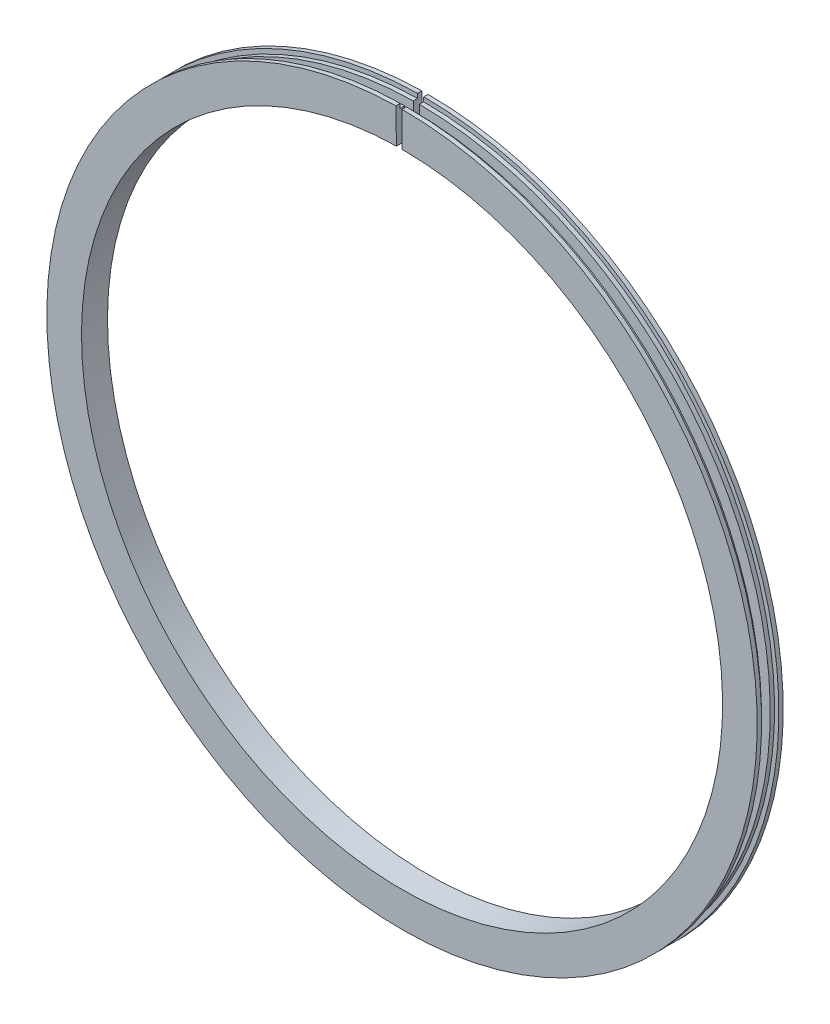
ISO-10303-21;
HEADER;
FILE_DESCRIPTION(('STEP AP214'),'2;1');
FILE_NAME('part.step','',(''),(''),'','','');
FILE_SCHEMA(('AUTOMOTIVE_DESIGN { 1 0 10303 214 1 1 1 1 }'));
ENDSEC;
DATA;
#1=APPLICATION_CONTEXT('core data for automotive mechanical design processes');
#2=APPLICATION_PROTOCOL_DEFINITION('international standard','automotive_design',2000,#1);
#3=PRODUCT_CONTEXT('',#1,'mechanical');
#4=PRODUCT('Part','Part','',(#3));
#5=PRODUCT_RELATED_PRODUCT_CATEGORY('part','',(#4));
#6=PRODUCT_DEFINITION_FORMATION('','',#4);
#7=PRODUCT_DEFINITION_CONTEXT('part definition',#1,'design');
#8=PRODUCT_DEFINITION('design','',#6,#7);
#9=PRODUCT_DEFINITION_SHAPE('','',#8);
#10=(LENGTH_UNIT() NAMED_UNIT(*) SI_UNIT(.MILLI.,.METRE.));
#11=(NAMED_UNIT(*) PLANE_ANGLE_UNIT() SI_UNIT($,.RADIAN.));
#12=(NAMED_UNIT(*) SI_UNIT($,.STERADIAN.) SOLID_ANGLE_UNIT());
#13=UNCERTAINTY_MEASURE_WITH_UNIT(LENGTH_MEASURE(1.E-05),#10,'distance_accuracy_value','');
#14=(GEOMETRIC_REPRESENTATION_CONTEXT(3) GLOBAL_UNCERTAINTY_ASSIGNED_CONTEXT((#13)) GLOBAL_UNIT_ASSIGNED_CONTEXT((#10,
#11,#12)) REPRESENTATION_CONTEXT('',''));
#15=CARTESIAN_POINT('',(0.,0.,0.));
#16=DIRECTION('',(0.,0.,1.));
#17=DIRECTION('',(1.,0.,0.));
#18=AXIS2_PLACEMENT_3D('',#15,#16,#17);
#19=CARTESIAN_POINT('',(0.,0.,0.));
#20=DIRECTION('',(0.,0.,1.));
#21=DIRECTION('',(1.,0.,0.));
#22=AXIS2_PLACEMENT_3D('',#19,#20,#21);
#23=CYLINDRICAL_SURFACE('',#22,37.);
#24=CARTESIAN_POINT('',(0.,0.,-3.));
#25=DIRECTION('',(0.,0.,1.));
#26=DIRECTION('',(1.,0.,0.));
#27=AXIS2_PLACEMENT_3D('',#24,#25,#26);
#28=CIRCLE('',#27,37.);
#29=CARTESIAN_POINT('',(-0.645739038178966,36.9943647207865,-3.));
#30=VERTEX_POINT('',#29);
#31=CARTESIAN_POINT('',(0.,37.,-3.));
#32=VERTEX_POINT('',#31);
#33=EDGE_CURVE('E11',#30,#32,#28,.T.);
#34=ORIENTED_EDGE('',*,*,#33,.F.);
#35=DIRECTION('',(0.,0.,1.));
#36=VECTOR('',#35,1.);
#37=CARTESIAN_POINT('',(-0.645739038178966,36.9943647207865,0.));
#38=LINE('',#37,#36);
#39=CARTESIAN_POINT('',(-0.645739038178966,36.9943647207865,0.));
#40=VERTEX_POINT('',#39);
#41=EDGE_CURVE('E135',#30,#40,#38,.T.);
#42=ORIENTED_EDGE('',*,*,#41,.T.);
#43=CARTESIAN_POINT('',(0.,0.,0.));
#44=DIRECTION('',(0.,0.,1.));
#45=DIRECTION('',(1.,0.,0.));
#46=AXIS2_PLACEMENT_3D('',#43,#44,#45);
#47=CIRCLE('',#46,37.);
#48=CARTESIAN_POINT('',(0.,37.,0.));
#49=VERTEX_POINT('',#48);
#50=EDGE_CURVE('E130',#40,#49,#47,.T.);
#51=ORIENTED_EDGE('',*,*,#50,.T.);
#52=DIRECTION('',(0.,0.,1.));
#53=VECTOR('',#52,1.);
#54=CARTESIAN_POINT('',(0.,37.,0.));
#55=LINE('',#54,#53);
#56=EDGE_CURVE('E133',#32,#49,#55,.T.);
#57=ORIENTED_EDGE('',*,*,#56,.F.);
#58=EDGE_LOOP('',(#34,#42,#51,#57));
#59=FACE_BOUND('',#58,.T.);
#60=ADVANCED_FACE('F45',(#59),#23,.F.);
#61=CARTESIAN_POINT('',(-0.645739038178966,36.9943647207865,-3.));
#62=DIRECTION('',(0.,0.,-1.));
#63=DIRECTION('',(-1.,0.,0.));
#64=AXIS2_PLACEMENT_3D('',#61,#62,#63);
#65=PLANE('',#64);
#66=CARTESIAN_POINT('',(0.,0.,-3.));
#67=DIRECTION('',(0.,0.,1.));
#68=DIRECTION('',(1.,0.,0.));
#69=AXIS2_PLACEMENT_3D('',#66,#67,#68);
#70=CIRCLE('',#69,41.);
#71=CARTESIAN_POINT('',(-0.715548663928043,40.993755501412,-3.));
#72=VERTEX_POINT('',#71);
#73=CARTESIAN_POINT('',(0.,41.,-3.));
#74=VERTEX_POINT('',#73);
#75=EDGE_CURVE('E54',#72,#74,#70,.T.);
#76=ORIENTED_EDGE('',*,*,#75,.F.);
#77=DIRECTION('',(0.0174524064372693,-0.999847695156391,0.));
#78=VECTOR('',#77,1.);
#79=CARTESIAN_POINT('',(-0.645739038178966,36.9943647207865,-3.));
#80=LINE('',#79,#78);
#81=EDGE_CURVE('E141',#72,#30,#80,.T.);
#82=ORIENTED_EDGE('',*,*,#81,.T.);
#83=ORIENTED_EDGE('',*,*,#33,.T.);
#84=DIRECTION('',(0.,-1.,0.));
#85=VECTOR('',#84,1.);
#86=CARTESIAN_POINT('',(0.,37.,-3.));
#87=LINE('',#86,#85);
#88=EDGE_CURVE('E155',#74,#32,#87,.T.);
#89=ORIENTED_EDGE('',*,*,#88,.F.);
#90=EDGE_LOOP('',(#76,#82,#83,#89));
#91=FACE_BOUND('',#90,.T.);
#92=ADVANCED_FACE('F47',(#91),#65,.T.);
#93=CARTESIAN_POINT('',(0.,0.,0.));
#94=DIRECTION('',(0.,0.,1.));
#95=DIRECTION('',(1.,0.,0.));
#96=AXIS2_PLACEMENT_3D('',#93,#94,#95);
#97=CYLINDRICAL_SURFACE('',#96,41.);
#98=CARTESIAN_POINT('',(0.,0.,-2.5));
#99=DIRECTION('',(0.,0.,1.));
#100=DIRECTION('',(1.,0.,0.));
#101=AXIS2_PLACEMENT_3D('',#98,#99,#100);
#102=CIRCLE('',#101,41.);
#103=CARTESIAN_POINT('',(-0.715548663928043,40.993755501412,-2.5));
#104=VERTEX_POINT('',#103);
#105=CARTESIAN_POINT('',(0.,41.,-2.5));
#106=VERTEX_POINT('',#105);
#107=EDGE_CURVE('E259',#104,#106,#102,.T.);
#108=ORIENTED_EDGE('',*,*,#107,.F.);
#109=DIRECTION('',(0.,0.,-1.));
#110=VECTOR('',#109,1.);
#111=CARTESIAN_POINT('',(-0.715548663928043,40.993755501412,-3.));
#112=LINE('',#111,#110);
#113=EDGE_CURVE('E231',#104,#72,#112,.T.);
#114=ORIENTED_EDGE('',*,*,#113,.T.);
#115=ORIENTED_EDGE('',*,*,#75,.T.);
#116=DIRECTION('',(0.,0.,-1.));
#117=VECTOR('',#116,1.);
#118=CARTESIAN_POINT('',(0.,41.,-3.));
#119=LINE('',#118,#117);
#120=EDGE_CURVE('E189',#106,#74,#119,.T.);
#121=ORIENTED_EDGE('',*,*,#120,.F.);
#122=EDGE_LOOP('',(#108,#114,#115,#121));
#123=FACE_BOUND('',#122,.T.);
#124=ADVANCED_FACE('F264',(#123),#97,.T.);
#125=CARTESIAN_POINT('',(-0.715548663928043,40.993755501412,-2.5));
#126=DIRECTION('',(0.,0.,1.));
#127=DIRECTION('',(1.,0.,0.));
#128=AXIS2_PLACEMENT_3D('',#125,#126,#127);
#129=PLANE('',#128);
#130=CARTESIAN_POINT('',(0.,0.,-2.5));
#131=DIRECTION('',(0.,0.,1.));
#132=DIRECTION('',(1.,0.,0.));
#133=AXIS2_PLACEMENT_3D('',#130,#131,#132);
#134=CIRCLE('',#133,40.5);
#135=CARTESIAN_POINT('',(-0.706822460709409,40.4938316538339,-2.5));
#136=VERTEX_POINT('',#135);
#137=CARTESIAN_POINT('',(0.,40.5,-2.5));
#138=VERTEX_POINT('',#137);
#139=EDGE_CURVE('E256',#136,#138,#134,.T.);
#140=ORIENTED_EDGE('',*,*,#139,.F.);
#141=DIRECTION('',(-0.0174524064372693,0.999847695156391,0.));
#142=VECTOR('',#141,1.);
#143=CARTESIAN_POINT('',(-0.715548663928043,40.993755501412,-2.5));
#144=LINE('',#143,#142);
#145=EDGE_CURVE('E227',#136,#104,#144,.T.);
#146=ORIENTED_EDGE('',*,*,#145,.T.);
#147=ORIENTED_EDGE('',*,*,#107,.T.);
#148=DIRECTION('',(0.,1.,0.));
#149=VECTOR('',#148,1.);
#150=CARTESIAN_POINT('',(0.,41.,-2.5));
#151=LINE('',#150,#149);
#152=EDGE_CURVE('E185',#138,#106,#151,.T.);
#153=ORIENTED_EDGE('',*,*,#152,.F.);
#154=EDGE_LOOP('',(#140,#146,#147,#153));
#155=FACE_BOUND('',#154,.T.);
#156=ADVANCED_FACE('F299',(#155),#129,.T.);
#157=CARTESIAN_POINT('',(0.,0.,0.));
#158=DIRECTION('',(0.,0.,1.));
#159=DIRECTION('',(1.,0.,0.));
#160=AXIS2_PLACEMENT_3D('',#157,#158,#159);
#161=CYLINDRICAL_SURFACE('',#160,40.5);
#162=CARTESIAN_POINT('',(0.,0.,-2.));
#163=DIRECTION('',(0.,0.,1.));
#164=DIRECTION('',(1.,0.,0.));
#165=AXIS2_PLACEMENT_3D('',#162,#163,#164);
#166=CIRCLE('',#165,40.5);
#167=CARTESIAN_POINT('',(-0.706822460709409,40.4938316538339,-2.));
#168=VERTEX_POINT('',#167);
#169=CARTESIAN_POINT('',(0.,40.5,-2.));
#170=VERTEX_POINT('',#169);
#171=EDGE_CURVE('E253',#168,#170,#166,.T.);
#172=ORIENTED_EDGE('',*,*,#171,.F.);
#173=DIRECTION('',(0.,0.,-1.));
#174=VECTOR('',#173,1.);
#175=CARTESIAN_POINT('',(-0.706822460709409,40.4938316538339,-2.5));
#176=LINE('',#175,#174);
#177=EDGE_CURVE('E223',#168,#136,#176,.T.);
#178=ORIENTED_EDGE('',*,*,#177,.T.);
#179=ORIENTED_EDGE('',*,*,#139,.T.);
#180=DIRECTION('',(0.,0.,-1.));
#181=VECTOR('',#180,1.);
#182=CARTESIAN_POINT('',(0.,40.5,-2.5));
#183=LINE('',#182,#181);
#184=EDGE_CURVE('E181',#170,#138,#183,.T.);
#185=ORIENTED_EDGE('',*,*,#184,.F.);
#186=EDGE_LOOP('',(#172,#178,#179,#185));
#187=FACE_BOUND('',#186,.T.);
#188=ADVANCED_FACE('F296',(#187),#161,.T.);
#189=CARTESIAN_POINT('',(-0.706822460709409,40.4938316538339,-2.));
#190=DIRECTION('',(0.,0.,1.));
#191=DIRECTION('',(1.,0.,0.));
#192=AXIS2_PLACEMENT_3D('',#189,#190,#191);
#193=PLANE('',#192);
#194=CARTESIAN_POINT('',(0.,0.,-2.));
#195=DIRECTION('',(0.,0.,1.));
#196=DIRECTION('',(1.,0.,0.));
#197=AXIS2_PLACEMENT_3D('',#194,#195,#196);
#198=CIRCLE('',#197,38.5);
#199=CARTESIAN_POINT('',(-0.67191764783487,38.4941362635211,-2.));
#200=VERTEX_POINT('',#199);
#201=CARTESIAN_POINT('',(0.,38.5,-2.));
#202=VERTEX_POINT('',#201);
#203=EDGE_CURVE('E250',#200,#202,#198,.T.);
#204=ORIENTED_EDGE('',*,*,#203,.F.);
#205=DIRECTION('',(-0.0174524064372693,0.999847695156391,0.));
#206=VECTOR('',#205,1.);
#207=CARTESIAN_POINT('',(-0.706822460709409,40.4938316538339,-2.));
#208=LINE('',#207,#206);
#209=EDGE_CURVE('E219',#200,#168,#208,.T.);
#210=ORIENTED_EDGE('',*,*,#209,.T.);
#211=ORIENTED_EDGE('',*,*,#171,.T.);
#212=DIRECTION('',(0.,1.,0.));
#213=VECTOR('',#212,1.);
#214=CARTESIAN_POINT('',(0.,40.5,-2.));
#215=LINE('',#214,#213);
#216=EDGE_CURVE('E177',#202,#170,#215,.T.);
#217=ORIENTED_EDGE('',*,*,#216,.F.);
#218=EDGE_LOOP('',(#204,#210,#211,#217));
#219=FACE_BOUND('',#218,.T.);
#220=ADVANCED_FACE('F293',(#219),#193,.T.);
#221=CARTESIAN_POINT('',(0.,0.,0.));
#222=DIRECTION('',(0.,0.,1.));
#223=DIRECTION('',(1.,0.,0.));
#224=AXIS2_PLACEMENT_3D('',#221,#222,#223);
#225=CYLINDRICAL_SURFACE('',#224,38.5);
#226=CARTESIAN_POINT('',(0.,0.,-1.));
#227=DIRECTION('',(0.,0.,1.));
#228=DIRECTION('',(1.,0.,0.));
#229=AXIS2_PLACEMENT_3D('',#226,#227,#228);
#230=CIRCLE('',#229,38.5);
#231=CARTESIAN_POINT('',(-0.67191764783487,38.4941362635211,-1.));
#232=VERTEX_POINT('',#231);
#233=CARTESIAN_POINT('',(0.,38.5,-1.));
#234=VERTEX_POINT('',#233);
#235=EDGE_CURVE('E247',#232,#234,#230,.T.);
#236=ORIENTED_EDGE('',*,*,#235,.F.);
#237=DIRECTION('',(0.,0.,-1.));
#238=VECTOR('',#237,1.);
#239=CARTESIAN_POINT('',(-0.67191764783487,38.4941362635211,-1.));
#240=LINE('',#239,#238);
#241=EDGE_CURVE('E215',#232,#200,#240,.T.);
#242=ORIENTED_EDGE('',*,*,#241,.T.);
#243=ORIENTED_EDGE('',*,*,#203,.T.);
#244=DIRECTION('',(0.,0.,-1.));
#245=VECTOR('',#244,1.);
#246=CARTESIAN_POINT('',(0.,38.5,-1.));
#247=LINE('',#246,#245);
#248=EDGE_CURVE('E173',#234,#202,#247,.T.);
#249=ORIENTED_EDGE('',*,*,#248,.F.);
#250=EDGE_LOOP('',(#236,#242,#243,#249));
#251=FACE_BOUND('',#250,.T.);
#252=ADVANCED_FACE('F288',(#251),#225,.T.);
#253=CARTESIAN_POINT('',(-0.706822460709409,40.4938316538339,-1.));
#254=DIRECTION('',(0.,0.,-1.));
#255=DIRECTION('',(-1.,0.,0.));
#256=AXIS2_PLACEMENT_3D('',#253,#254,#255);
#257=PLANE('',#256);
#258=CARTESIAN_POINT('',(0.,0.,-1.));
#259=DIRECTION('',(0.,0.,1.));
#260=DIRECTION('',(1.,0.,0.));
#261=AXIS2_PLACEMENT_3D('',#258,#259,#260);
#262=CIRCLE('',#261,40.5);
#263=CARTESIAN_POINT('',(-0.706822460709409,40.4938316538339,-1.));
#264=VERTEX_POINT('',#263);
#265=CARTESIAN_POINT('',(0.,40.5,-1.));
#266=VERTEX_POINT('',#265);
#267=EDGE_CURVE('E244',#264,#266,#262,.T.);
#268=ORIENTED_EDGE('',*,*,#267,.F.);
#269=DIRECTION('',(0.0174524064372693,-0.999847695156391,0.));
#270=VECTOR('',#269,1.);
#271=CARTESIAN_POINT('',(-0.706822460709409,40.4938316538339,-1.));
#272=LINE('',#271,#270);
#273=EDGE_CURVE('E211',#264,#232,#272,.T.);
#274=ORIENTED_EDGE('',*,*,#273,.T.);
#275=ORIENTED_EDGE('',*,*,#235,.T.);
#276=DIRECTION('',(0.,-1.,0.));
#277=VECTOR('',#276,1.);
#278=CARTESIAN_POINT('',(0.,40.5,-1.));
#279=LINE('',#278,#277);
#280=EDGE_CURVE('E169',#266,#234,#279,.T.);
#281=ORIENTED_EDGE('',*,*,#280,.F.);
#282=EDGE_LOOP('',(#268,#274,#275,#281));
#283=FACE_BOUND('',#282,.T.);
#284=ADVANCED_FACE('F285',(#283),#257,.T.);
#285=CARTESIAN_POINT('',(0.,0.,0.));
#286=DIRECTION('',(0.,0.,1.));
#287=DIRECTION('',(1.,0.,0.));
#288=AXIS2_PLACEMENT_3D('',#285,#286,#287);
#289=CYLINDRICAL_SURFACE('',#288,40.5);
#290=CARTESIAN_POINT('',(0.,0.,-0.5));
#291=DIRECTION('',(0.,0.,1.));
#292=DIRECTION('',(1.,0.,0.));
#293=AXIS2_PLACEMENT_3D('',#290,#291,#292);
#294=CIRCLE('',#293,40.5);
#295=CARTESIAN_POINT('',(-0.706822460709409,40.4938316538339,-0.5));
#296=VERTEX_POINT('',#295);
#297=CARTESIAN_POINT('',(0.,40.5,-0.5));
#298=VERTEX_POINT('',#297);
#299=EDGE_CURVE('E241',#296,#298,#294,.T.);
#300=ORIENTED_EDGE('',*,*,#299,.F.);
#301=DIRECTION('',(0.,0.,-1.));
#302=VECTOR('',#301,1.);
#303=CARTESIAN_POINT('',(-0.706822460709409,40.4938316538339,-0.5));
#304=LINE('',#303,#302);
#305=EDGE_CURVE('E207',#296,#264,#304,.T.);
#306=ORIENTED_EDGE('',*,*,#305,.T.);
#307=ORIENTED_EDGE('',*,*,#267,.T.);
#308=DIRECTION('',(0.,0.,-1.));
#309=VECTOR('',#308,1.);
#310=CARTESIAN_POINT('',(0.,40.5,-0.5));
#311=LINE('',#310,#309);
#312=EDGE_CURVE('E165',#298,#266,#311,.T.);
#313=ORIENTED_EDGE('',*,*,#312,.F.);
#314=EDGE_LOOP('',(#300,#306,#307,#313));
#315=FACE_BOUND('',#314,.T.);
#316=ADVANCED_FACE('F280',(#315),#289,.T.);
#317=CARTESIAN_POINT('',(-0.715548663928043,40.993755501412,-0.5));
#318=DIRECTION('',(0.,0.,-1.));
#319=DIRECTION('',(-1.,0.,0.));
#320=AXIS2_PLACEMENT_3D('',#317,#318,#319);
#321=PLANE('',#320);
#322=CARTESIAN_POINT('',(0.,0.,-0.5));
#323=DIRECTION('',(0.,0.,1.));
#324=DIRECTION('',(1.,0.,0.));
#325=AXIS2_PLACEMENT_3D('',#322,#323,#324);
#326=CIRCLE('',#325,41.);
#327=CARTESIAN_POINT('',(-0.715548663928043,40.993755501412,-0.5));
#328=VERTEX_POINT('',#327);
#329=CARTESIAN_POINT('',(0.,41.,-0.5));
#330=VERTEX_POINT('',#329);
#331=EDGE_CURVE('E238',#328,#330,#326,.T.);
#332=ORIENTED_EDGE('',*,*,#331,.F.);
#333=DIRECTION('',(0.0174524064372693,-0.999847695156391,0.));
#334=VECTOR('',#333,1.);
#335=CARTESIAN_POINT('',(-0.715548663928043,40.993755501412,-0.5));
#336=LINE('',#335,#334);
#337=EDGE_CURVE('E203',#328,#296,#336,.T.);
#338=ORIENTED_EDGE('',*,*,#337,.T.);
#339=ORIENTED_EDGE('',*,*,#299,.T.);
#340=DIRECTION('',(0.,-1.,0.));
#341=VECTOR('',#340,1.);
#342=CARTESIAN_POINT('',(0.,41.,-0.5));
#343=LINE('',#342,#341);
#344=EDGE_CURVE('E161',#330,#298,#343,.T.);
#345=ORIENTED_EDGE('',*,*,#344,.F.);
#346=EDGE_LOOP('',(#332,#338,#339,#345));
#347=FACE_BOUND('',#346,.T.);
#348=ADVANCED_FACE('F278',(#347),#321,.T.);
#349=CARTESIAN_POINT('',(0.,0.,0.));
#350=DIRECTION('',(0.,0.,1.));
#351=DIRECTION('',(1.,0.,0.));
#352=AXIS2_PLACEMENT_3D('',#349,#350,#351);
#353=CYLINDRICAL_SURFACE('',#352,41.);
#354=CARTESIAN_POINT('',(0.,0.,0.));
#355=DIRECTION('',(0.,0.,1.));
#356=DIRECTION('',(1.,0.,0.));
#357=AXIS2_PLACEMENT_3D('',#354,#355,#356);
#358=CIRCLE('',#357,41.);
#359=CARTESIAN_POINT('',(-0.715548663928043,40.993755501412,0.));
#360=VERTEX_POINT('',#359);
#361=CARTESIAN_POINT('',(0.,41.,0.));
#362=VERTEX_POINT('',#361);
#363=EDGE_CURVE('E140',#360,#362,#358,.T.);
#364=ORIENTED_EDGE('',*,*,#363,.F.);
#365=DIRECTION('',(0.,0.,-1.));
#366=VECTOR('',#365,1.);
#367=CARTESIAN_POINT('',(-0.715548663928043,40.993755501412,0.));
#368=LINE('',#367,#366);
#369=EDGE_CURVE('E199',#360,#328,#368,.T.);
#370=ORIENTED_EDGE('',*,*,#369,.T.);
#371=ORIENTED_EDGE('',*,*,#331,.T.);
#372=DIRECTION('',(0.,0.,-1.));
#373=VECTOR('',#372,1.);
#374=CARTESIAN_POINT('',(0.,41.,0.));
#375=LINE('',#374,#373);
#376=EDGE_CURVE('E150',#362,#330,#375,.T.);
#377=ORIENTED_EDGE('',*,*,#376,.F.);
#378=EDGE_LOOP('',(#364,#370,#371,#377));
#379=FACE_BOUND('',#378,.T.);
#380=ADVANCED_FACE('F274',(#379),#353,.T.);
#381=CARTESIAN_POINT('',(-0.645739038178966,36.9943647207865,0.));
#382=DIRECTION('',(0.,0.,1.));
#383=DIRECTION('',(1.,0.,0.));
#384=AXIS2_PLACEMENT_3D('',#381,#382,#383);
#385=PLANE('',#384);
#386=DIRECTION('',(-0.0174524064372693,0.999847695156391,0.));
#387=VECTOR('',#386,1.);
#388=CARTESIAN_POINT('',(-0.645739038178966,36.9943647207865,0.));
#389=LINE('',#388,#387);
#390=EDGE_CURVE('E196',#40,#360,#389,.T.);
#391=ORIENTED_EDGE('',*,*,#390,.T.);
#392=ORIENTED_EDGE('',*,*,#363,.T.);
#393=DIRECTION('',(0.,1.,0.));
#394=VECTOR('',#393,1.);
#395=CARTESIAN_POINT('',(0.,37.,0.));
#396=LINE('',#395,#394);
#397=EDGE_CURVE('E144',#49,#362,#396,.T.);
#398=ORIENTED_EDGE('',*,*,#397,.F.);
#399=ORIENTED_EDGE('',*,*,#50,.F.);
#400=EDGE_LOOP('',(#391,#392,#398,#399));
#401=FACE_BOUND('',#400,.T.);
#402=ADVANCED_FACE('F145',(#401),#385,.T.);
#403=CARTESIAN_POINT('',(0.,0.,0.));
#404=DIRECTION('',(0.999847695156391,0.0174524064372693,0.));
#405=DIRECTION('',(0.,0.,-1.));
#406=AXIS2_PLACEMENT_3D('',#403,#404,#405);
#407=PLANE('',#406);
#408=ORIENTED_EDGE('',*,*,#41,.F.);
#409=ORIENTED_EDGE('',*,*,#81,.F.);
#410=ORIENTED_EDGE('',*,*,#113,.F.);
#411=ORIENTED_EDGE('',*,*,#145,.F.);
#412=ORIENTED_EDGE('',*,*,#177,.F.);
#413=ORIENTED_EDGE('',*,*,#209,.F.);
#414=ORIENTED_EDGE('',*,*,#241,.F.);
#415=ORIENTED_EDGE('',*,*,#273,.F.);
#416=ORIENTED_EDGE('',*,*,#305,.F.);
#417=ORIENTED_EDGE('',*,*,#337,.F.);
#418=ORIENTED_EDGE('',*,*,#369,.F.);
#419=ORIENTED_EDGE('',*,*,#390,.F.);
#420=EDGE_LOOP('',(#408,#409,#410,#411,#412,#413,#414,#415,#416,#417,#418,#419));
#421=FACE_BOUND('',#420,.T.);
#422=ADVANCED_FACE('F269',(#421),#407,.T.);
#423=CARTESIAN_POINT('',(0.,0.,0.));
#424=DIRECTION('',(1.,0.,0.));
#425=DIRECTION('',(0.,0.,-1.));
#426=AXIS2_PLACEMENT_3D('',#423,#424,#425);
#427=PLANE('',#426);
#428=ORIENTED_EDGE('',*,*,#56,.T.);
#429=ORIENTED_EDGE('',*,*,#397,.T.);
#430=ORIENTED_EDGE('',*,*,#376,.T.);
#431=ORIENTED_EDGE('',*,*,#344,.T.);
#432=ORIENTED_EDGE('',*,*,#312,.T.);
#433=ORIENTED_EDGE('',*,*,#280,.T.);
#434=ORIENTED_EDGE('',*,*,#248,.T.);
#435=ORIENTED_EDGE('',*,*,#216,.T.);
#436=ORIENTED_EDGE('',*,*,#184,.T.);
#437=ORIENTED_EDGE('',*,*,#152,.T.);
#438=ORIENTED_EDGE('',*,*,#120,.T.);
#439=ORIENTED_EDGE('',*,*,#88,.T.);
#440=EDGE_LOOP('',(#428,#429,#430,#431,#432,#433,#434,#435,#436,#437,#438,#439));
#441=FACE_BOUND('',#440,.T.);
#442=ADVANCED_FACE('F153',(#441),#427,.F.);
#443=CLOSED_SHELL('',(#60,#92,#124,#156,#188,#220,#252,#284,#316,#348,#380,#402,#422,#442));
#444=MANIFOLD_SOLID_BREP('B2',#443);
#445=ADVANCED_BREP_SHAPE_REPRESENTATION('',(#18,#444),#14);
#446=SHAPE_DEFINITION_REPRESENTATION(#9,#445);
ENDSEC;
END-ISO-10303-21;
